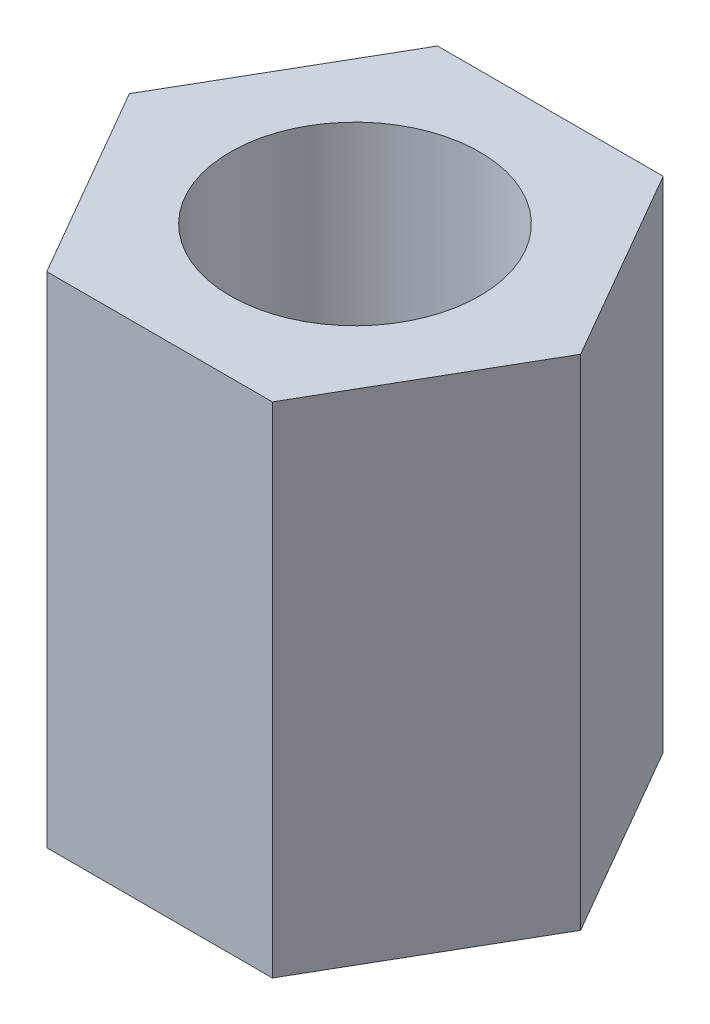
ISO-10303-21;
HEADER;
FILE_DESCRIPTION(('STEP AP214'),'2;1');
FILE_NAME('part.step','',(''),(''),'','','');
FILE_SCHEMA(('AUTOMOTIVE_DESIGN { 1 0 10303 214 1 1 1 1 }'));
ENDSEC;
DATA;
#1=APPLICATION_CONTEXT('core data for automotive mechanical design processes');
#2=APPLICATION_PROTOCOL_DEFINITION('international standard','automotive_design',2000,#1);
#3=PRODUCT_CONTEXT('',#1,'mechanical');
#4=PRODUCT('Part','Part','',(#3));
#5=PRODUCT_RELATED_PRODUCT_CATEGORY('part','',(#4));
#6=PRODUCT_DEFINITION_FORMATION('','',#4);
#7=PRODUCT_DEFINITION_CONTEXT('part definition',#1,'design');
#8=PRODUCT_DEFINITION('design','',#6,#7);
#9=PRODUCT_DEFINITION_SHAPE('','',#8);
#10=(LENGTH_UNIT() NAMED_UNIT(*) SI_UNIT(.MILLI.,.METRE.));
#11=(NAMED_UNIT(*) PLANE_ANGLE_UNIT() SI_UNIT($,.RADIAN.));
#12=(NAMED_UNIT(*) SI_UNIT($,.STERADIAN.) SOLID_ANGLE_UNIT());
#13=UNCERTAINTY_MEASURE_WITH_UNIT(LENGTH_MEASURE(1.E-05),#10,'distance_accuracy_value','');
#14=(GEOMETRIC_REPRESENTATION_CONTEXT(3) GLOBAL_UNCERTAINTY_ASSIGNED_CONTEXT((#13)) GLOBAL_UNIT_ASSIGNED_CONTEXT((#10,
#11,#12)) REPRESENTATION_CONTEXT('',''));
#15=CARTESIAN_POINT('',(0.,0.,0.));
#16=DIRECTION('',(0.,0.,1.));
#17=DIRECTION('',(1.,0.,0.));
#18=AXIS2_PLACEMENT_3D('',#15,#16,#17);
#19=CARTESIAN_POINT('',(0.,6.,0.));
#20=DIRECTION('',(0.,1.,0.));
#21=DIRECTION('',(0.,0.,1.));
#22=AXIS2_PLACEMENT_3D('',#19,#20,#21);
#23=PLANE('',#22);
#24=DIRECTION('',(0.5,0.,-0.866025403784439));
#25=VECTOR('',#24,1.);
#26=CARTESIAN_POINT('',(1.35677313259562,6.,2.35));
#27=LINE('',#26,#25);
#28=CARTESIAN_POINT('',(1.35677313259562,6.,2.35));
#29=VERTEX_POINT('',#28);
#30=CARTESIAN_POINT('',(2.71354626519124,6.,0.));
#31=VERTEX_POINT('',#30);
#32=EDGE_CURVE('E148',#29,#31,#27,.T.);
#33=ORIENTED_EDGE('',*,*,#32,.T.);
#34=DIRECTION('',(-0.5,0.,-0.866025403784439));
#35=VECTOR('',#34,1.);
#36=CARTESIAN_POINT('',(2.71354626519124,6.,0.));
#37=LINE('',#36,#35);
#38=CARTESIAN_POINT('',(1.35677313259562,6.,-2.35));
#39=VERTEX_POINT('',#38);
#40=EDGE_CURVE('E96',#31,#39,#37,.T.);
#41=ORIENTED_EDGE('',*,*,#40,.T.);
#42=DIRECTION('',(-1.,0.,0.));
#43=VECTOR('',#42,1.);
#44=CARTESIAN_POINT('',(1.35677313259562,6.,-2.35));
#45=LINE('',#44,#43);
#46=CARTESIAN_POINT('',(-1.35677313259562,6.,-2.35));
#47=VERTEX_POINT('',#46);
#48=EDGE_CURVE('E109',#39,#47,#45,.T.);
#49=ORIENTED_EDGE('',*,*,#48,.T.);
#50=DIRECTION('',(-0.5,0.,0.866025403784439));
#51=VECTOR('',#50,1.);
#52=CARTESIAN_POINT('',(-1.35677313259562,6.,-2.35));
#53=LINE('',#52,#51);
#54=CARTESIAN_POINT('',(-2.71354626519124,6.,0.));
#55=VERTEX_POINT('',#54);
#56=EDGE_CURVE('E103',#47,#55,#53,.T.);
#57=ORIENTED_EDGE('',*,*,#56,.T.);
#58=DIRECTION('',(0.5,0.,0.866025403784439));
#59=VECTOR('',#58,1.);
#60=CARTESIAN_POINT('',(-2.71354626519124,6.,0.));
#61=LINE('',#60,#59);
#62=CARTESIAN_POINT('',(-1.35677313259562,6.,2.35));
#63=VERTEX_POINT('',#62);
#64=EDGE_CURVE('E107',#55,#63,#61,.T.);
#65=ORIENTED_EDGE('',*,*,#64,.T.);
#66=DIRECTION('',(1.,0.,0.));
#67=VECTOR('',#66,1.);
#68=CARTESIAN_POINT('',(-1.35677313259562,6.,2.35));
#69=LINE('',#68,#67);
#70=EDGE_CURVE('E59',#63,#29,#69,.T.);
#71=ORIENTED_EDGE('',*,*,#70,.T.);
#72=EDGE_LOOP('',(#33,#41,#49,#57,#65,#71));
#73=FACE_BOUND('',#72,.T.);
#74=CARTESIAN_POINT('',(0.,6.,0.));
#75=DIRECTION('',(0.,1.,0.));
#76=DIRECTION('',(0.,0.,1.));
#77=AXIS2_PLACEMENT_3D('',#74,#75,#76);
#78=CIRCLE('',#77,1.5);
#79=CARTESIAN_POINT('',(0.,6.,1.5));
#80=VERTEX_POINT('',#79);
#81=EDGE_CURVE('E136',#80,#80,#78,.T.);
#82=ORIENTED_EDGE('',*,*,#81,.F.);
#83=EDGE_LOOP('',(#82));
#84=FACE_BOUND('',#83,.T.);
#85=ADVANCED_FACE('F41',(#73,#84),#23,.T.);
#86=CARTESIAN_POINT('',(0.,0.,0.));
#87=DIRECTION('',(0.,1.,0.));
#88=DIRECTION('',(0.,0.,1.));
#89=AXIS2_PLACEMENT_3D('',#86,#87,#88);
#90=PLANE('',#89);
#91=DIRECTION('',(0.5,0.,-0.866025403784439));
#92=VECTOR('',#91,1.);
#93=CARTESIAN_POINT('',(1.35677313259562,0.,2.35));
#94=LINE('',#93,#92);
#95=CARTESIAN_POINT('',(1.35677313259562,0.,2.35));
#96=VERTEX_POINT('',#95);
#97=CARTESIAN_POINT('',(2.71354626519124,0.,0.));
#98=VERTEX_POINT('',#97);
#99=EDGE_CURVE('E131',#96,#98,#94,.T.);
#100=ORIENTED_EDGE('',*,*,#99,.F.);
#101=DIRECTION('',(1.,0.,0.));
#102=VECTOR('',#101,1.);
#103=CARTESIAN_POINT('',(-1.35677313259562,0.,2.35));
#104=LINE('',#103,#102);
#105=CARTESIAN_POINT('',(-1.35677313259562,0.,2.35));
#106=VERTEX_POINT('',#105);
#107=EDGE_CURVE('E88',#106,#96,#104,.T.);
#108=ORIENTED_EDGE('',*,*,#107,.F.);
#109=DIRECTION('',(0.5,0.,0.866025403784439));
#110=VECTOR('',#109,1.);
#111=CARTESIAN_POINT('',(-2.71354626519124,0.,0.));
#112=LINE('',#111,#110);
#113=CARTESIAN_POINT('',(-2.71354626519124,0.,0.));
#114=VERTEX_POINT('',#113);
#115=EDGE_CURVE('E82',#114,#106,#112,.T.);
#116=ORIENTED_EDGE('',*,*,#115,.F.);
#117=DIRECTION('',(-0.5,0.,0.866025403784439));
#118=VECTOR('',#117,1.);
#119=CARTESIAN_POINT('',(-1.35677313259562,0.,-2.35));
#120=LINE('',#119,#118);
#121=CARTESIAN_POINT('',(-1.35677313259562,0.,-2.35));
#122=VERTEX_POINT('',#121);
#123=EDGE_CURVE('E118',#122,#114,#120,.T.);
#124=ORIENTED_EDGE('',*,*,#123,.F.);
#125=DIRECTION('',(-1.,0.,0.));
#126=VECTOR('',#125,1.);
#127=CARTESIAN_POINT('',(1.35677313259562,0.,-2.35));
#128=LINE('',#127,#126);
#129=CARTESIAN_POINT('',(1.35677313259562,0.,-2.35));
#130=VERTEX_POINT('',#129);
#131=EDGE_CURVE('E139',#130,#122,#128,.T.);
#132=ORIENTED_EDGE('',*,*,#131,.F.);
#133=DIRECTION('',(-0.5,0.,-0.866025403784439));
#134=VECTOR('',#133,1.);
#135=CARTESIAN_POINT('',(2.71354626519124,0.,0.));
#136=LINE('',#135,#134);
#137=EDGE_CURVE('E135',#98,#130,#136,.T.);
#138=ORIENTED_EDGE('',*,*,#137,.F.);
#139=EDGE_LOOP('',(#100,#108,#116,#124,#132,#138));
#140=FACE_BOUND('',#139,.T.);
#141=CARTESIAN_POINT('',(0.,0.,0.));
#142=DIRECTION('',(0.,1.,0.));
#143=DIRECTION('',(0.,0.,1.));
#144=AXIS2_PLACEMENT_3D('',#141,#142,#143);
#145=CIRCLE('',#144,1.5);
#146=CARTESIAN_POINT('',(0.,0.,1.5));
#147=VERTEX_POINT('',#146);
#148=EDGE_CURVE('E245',#147,#147,#145,.T.);
#149=ORIENTED_EDGE('',*,*,#148,.T.);
#150=EDGE_LOOP('',(#149));
#151=FACE_BOUND('',#150,.T.);
#152=ADVANCED_FACE('F161',(#140,#151),#90,.F.);
#153=CARTESIAN_POINT('',(1.35677313259562,6.,2.35));
#154=DIRECTION('',(-0.866025403784439,0.,-0.5));
#155=DIRECTION('',(-0.5,0.,0.866025403784439));
#156=AXIS2_PLACEMENT_3D('',#153,#154,#155);
#157=PLANE('',#156);
#158=ORIENTED_EDGE('',*,*,#99,.T.);
#159=DIRECTION('',(0.,-1.,0.));
#160=VECTOR('',#159,1.);
#161=CARTESIAN_POINT('',(2.71354626519124,6.,0.));
#162=LINE('',#161,#160);
#163=EDGE_CURVE('E11',#31,#98,#162,.T.);
#164=ORIENTED_EDGE('',*,*,#163,.F.);
#165=ORIENTED_EDGE('',*,*,#32,.F.);
#166=DIRECTION('',(0.,-1.,0.));
#167=VECTOR('',#166,1.);
#168=CARTESIAN_POINT('',(1.35677313259562,6.,2.35));
#169=LINE('',#168,#167);
#170=EDGE_CURVE('E127',#29,#96,#169,.T.);
#171=ORIENTED_EDGE('',*,*,#170,.T.);
#172=EDGE_LOOP('',(#158,#164,#165,#171));
#173=FACE_BOUND('',#172,.T.);
#174=ADVANCED_FACE('F43',(#173),#157,.F.);
#175=CARTESIAN_POINT('',(2.71354626519124,6.,0.));
#176=DIRECTION('',(-0.866025403784438,0.,0.5));
#177=DIRECTION('',(0.5,0.,0.866025403784439));
#178=AXIS2_PLACEMENT_3D('',#175,#176,#177);
#179=PLANE('',#178);
#180=ORIENTED_EDGE('',*,*,#137,.T.);
#181=DIRECTION('',(0.,-1.,0.));
#182=VECTOR('',#181,1.);
#183=CARTESIAN_POINT('',(1.35677313259562,6.,-2.35));
#184=LINE('',#183,#182);
#185=EDGE_CURVE('E51',#39,#130,#184,.T.);
#186=ORIENTED_EDGE('',*,*,#185,.F.);
#187=ORIENTED_EDGE('',*,*,#40,.F.);
#188=ORIENTED_EDGE('',*,*,#163,.T.);
#189=EDGE_LOOP('',(#180,#186,#187,#188));
#190=FACE_BOUND('',#189,.T.);
#191=ADVANCED_FACE('F186',(#190),#179,.F.);
#192=CARTESIAN_POINT('',(1.35677313259562,6.,-2.35));
#193=DIRECTION('',(0.,0.,1.));
#194=DIRECTION('',(1.,0.,0.));
#195=AXIS2_PLACEMENT_3D('',#192,#193,#194);
#196=PLANE('',#195);
#197=ORIENTED_EDGE('',*,*,#131,.T.);
#198=DIRECTION('',(0.,-1.,0.));
#199=VECTOR('',#198,1.);
#200=CARTESIAN_POINT('',(-1.35677313259562,6.,-2.35));
#201=LINE('',#200,#199);
#202=EDGE_CURVE('E120',#47,#122,#201,.T.);
#203=ORIENTED_EDGE('',*,*,#202,.F.);
#204=ORIENTED_EDGE('',*,*,#48,.F.);
#205=ORIENTED_EDGE('',*,*,#185,.T.);
#206=EDGE_LOOP('',(#197,#203,#204,#205));
#207=FACE_BOUND('',#206,.T.);
#208=ADVANCED_FACE('F158',(#207),#196,.F.);
#209=CARTESIAN_POINT('',(-1.35677313259562,6.,-2.35));
#210=DIRECTION('',(0.866025403784439,0.,0.5));
#211=DIRECTION('',(0.5,0.,-0.866025403784439));
#212=AXIS2_PLACEMENT_3D('',#209,#210,#211);
#213=PLANE('',#212);
#214=ORIENTED_EDGE('',*,*,#123,.T.);
#215=DIRECTION('',(0.,-1.,0.));
#216=VECTOR('',#215,1.);
#217=CARTESIAN_POINT('',(-2.71354626519124,6.,0.));
#218=LINE('',#217,#216);
#219=EDGE_CURVE('E115',#55,#114,#218,.T.);
#220=ORIENTED_EDGE('',*,*,#219,.F.);
#221=ORIENTED_EDGE('',*,*,#56,.F.);
#222=ORIENTED_EDGE('',*,*,#202,.T.);
#223=EDGE_LOOP('',(#214,#220,#221,#222));
#224=FACE_BOUND('',#223,.T.);
#225=ADVANCED_FACE('F116',(#224),#213,.F.);
#226=CARTESIAN_POINT('',(-2.71354626519124,6.,0.));
#227=DIRECTION('',(0.866025403784439,0.,-0.5));
#228=DIRECTION('',(-0.5,0.,-0.866025403784439));
#229=AXIS2_PLACEMENT_3D('',#226,#227,#228);
#230=PLANE('',#229);
#231=ORIENTED_EDGE('',*,*,#115,.T.);
#232=DIRECTION('',(0.,-1.,0.));
#233=VECTOR('',#232,1.);
#234=CARTESIAN_POINT('',(-1.35677313259562,6.,2.35));
#235=LINE('',#234,#233);
#236=EDGE_CURVE('E121',#63,#106,#235,.T.);
#237=ORIENTED_EDGE('',*,*,#236,.F.);
#238=ORIENTED_EDGE('',*,*,#64,.F.);
#239=ORIENTED_EDGE('',*,*,#219,.T.);
#240=EDGE_LOOP('',(#231,#237,#238,#239));
#241=FACE_BOUND('',#240,.T.);
#242=ADVANCED_FACE('F123',(#241),#230,.F.);
#243=CARTESIAN_POINT('',(-1.35677313259562,6.,2.35));
#244=DIRECTION('',(0.,0.,-1.));
#245=DIRECTION('',(-1.,0.,0.));
#246=AXIS2_PLACEMENT_3D('',#243,#244,#245);
#247=PLANE('',#246);
#248=ORIENTED_EDGE('',*,*,#107,.T.);
#249=ORIENTED_EDGE('',*,*,#170,.F.);
#250=ORIENTED_EDGE('',*,*,#70,.F.);
#251=ORIENTED_EDGE('',*,*,#236,.T.);
#252=EDGE_LOOP('',(#248,#249,#250,#251));
#253=FACE_BOUND('',#252,.T.);
#254=ADVANCED_FACE('F166',(#253),#247,.F.);
#255=CARTESIAN_POINT('',(0.,6.,0.));
#256=DIRECTION('',(0.,-1.,0.));
#257=DIRECTION('',(0.,0.,-1.));
#258=AXIS2_PLACEMENT_3D('',#255,#256,#257);
#259=CYLINDRICAL_SURFACE('',#258,1.5);
#260=ORIENTED_EDGE('',*,*,#81,.T.);
#261=EDGE_LOOP('',(#260));
#262=FACE_BOUND('',#261,.T.);
#263=ORIENTED_EDGE('',*,*,#148,.F.);
#264=EDGE_LOOP('',(#263));
#265=FACE_BOUND('',#264,.T.);
#266=ADVANCED_FACE('F168',(#262,#265),#259,.F.);
#267=CLOSED_SHELL('',(#85,#152,#174,#191,#208,#225,#242,#254,#266));
#268=MANIFOLD_SOLID_BREP('B2',#267);
#269=ADVANCED_BREP_SHAPE_REPRESENTATION('',(#18,#268),#14);
#270=SHAPE_DEFINITION_REPRESENTATION(#9,#269);
ENDSEC;
END-ISO-10303-21;
